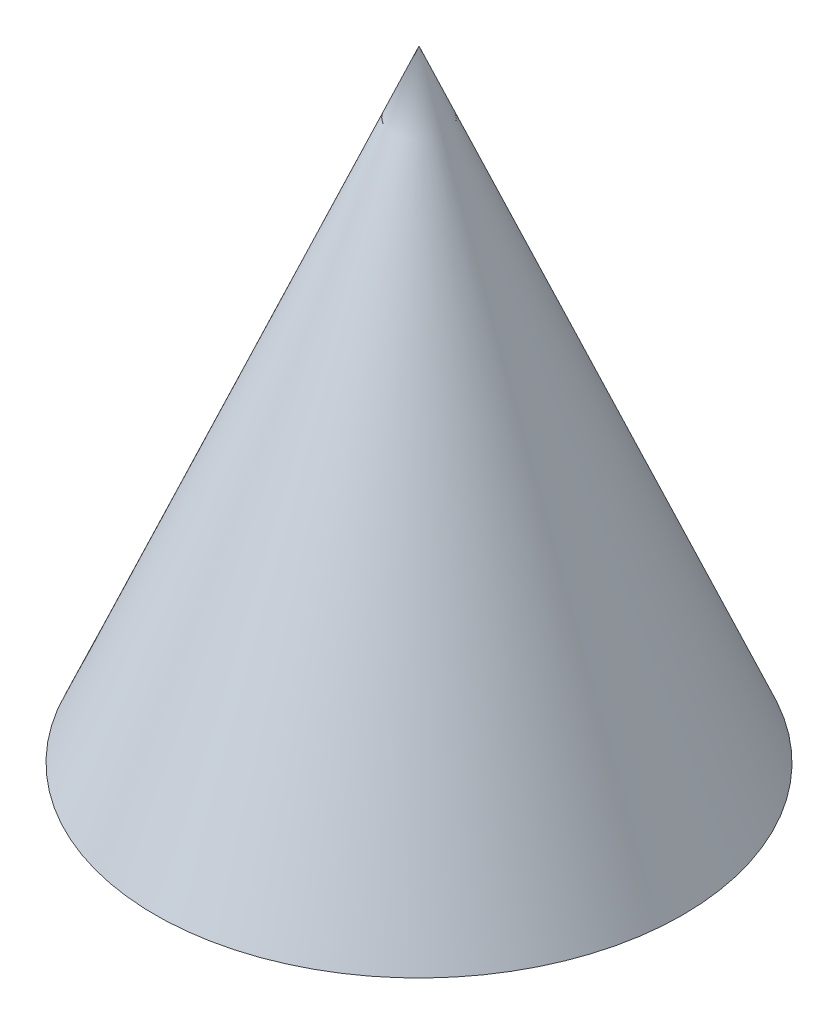
ISO-10303-21;
HEADER;
FILE_DESCRIPTION(('STEP AP214'),'2;1');
FILE_NAME('part.step','',(''),(''),'','','');
FILE_SCHEMA(('AUTOMOTIVE_DESIGN { 1 0 10303 214 1 1 1 1 }'));
ENDSEC;
DATA;
#1=APPLICATION_CONTEXT('core data for automotive mechanical design processes');
#2=APPLICATION_PROTOCOL_DEFINITION('international standard','automotive_design',2000,#1);
#3=PRODUCT_CONTEXT('',#1,'mechanical');
#4=PRODUCT('Part','Part','',(#3));
#5=PRODUCT_RELATED_PRODUCT_CATEGORY('part','',(#4));
#6=PRODUCT_DEFINITION_FORMATION('','',#4);
#7=PRODUCT_DEFINITION_CONTEXT('part definition',#1,'design');
#8=PRODUCT_DEFINITION('design','',#6,#7);
#9=PRODUCT_DEFINITION_SHAPE('','',#8);
#10=(LENGTH_UNIT() NAMED_UNIT(*) SI_UNIT(.MILLI.,.METRE.));
#11=(NAMED_UNIT(*) PLANE_ANGLE_UNIT() SI_UNIT($,.RADIAN.));
#12=(NAMED_UNIT(*) SI_UNIT($,.STERADIAN.) SOLID_ANGLE_UNIT());
#13=UNCERTAINTY_MEASURE_WITH_UNIT(LENGTH_MEASURE(1.E-05),#10,'distance_accuracy_value','');
#14=(GEOMETRIC_REPRESENTATION_CONTEXT(3) GLOBAL_UNCERTAINTY_ASSIGNED_CONTEXT((#13)) GLOBAL_UNIT_ASSIGNED_CONTEXT((#10,
#11,#12)) REPRESENTATION_CONTEXT('',''));
#15=CARTESIAN_POINT('',(0.,0.,0.));
#16=DIRECTION('',(0.,0.,1.));
#17=DIRECTION('',(1.,0.,0.));
#18=AXIS2_PLACEMENT_3D('',#15,#16,#17);
#19=CARTESIAN_POINT('',(0.,0.,0.));
#20=DIRECTION('',(0.,1.,0.));
#21=DIRECTION('',(-1.,0.,0.));
#22=AXIS2_PLACEMENT_3D('',#19,#20,#21);
#23=PLANE('',#22);
#24=CARTESIAN_POINT('',(0.,0.,0.));
#25=DIRECTION('',(0.,1.,0.));
#26=DIRECTION('',(-1.,0.,0.));
#27=AXIS2_PLACEMENT_3D('',#24,#25,#26);
#28=CIRCLE('',#27,1700.);
#29=CARTESIAN_POINT('',(-1700.,0.,0.));
#30=VERTEX_POINT('',#29);
#31=EDGE_CURVE('E11',#30,#30,#28,.T.);
#32=ORIENTED_EDGE('',*,*,#31,.F.);
#33=EDGE_LOOP('',(#32));
#34=FACE_BOUND('',#33,.T.);
#35=ADVANCED_FACE('F43',(#34),#23,.F.);
#36=CARTESIAN_POINT('',(0.,0.,0.));
#37=DIRECTION('',(0.,-1.,0.));
#38=DIRECTION('',(1.,0.,0.));
#39=AXIS2_PLACEMENT_3D('',#36,#37,#38);
#40=CONICAL_SURFACE('',#39,1700.,0.401870647440457);
#41=CARTESIAN_POINT('',(-1.97140511050713E-13,4000.,0.));
#42=VERTEX_POINT('',#41);
#43=VERTEX_LOOP('',#42);
#44=FACE_BOUND('',#43,.T.);
#45=ORIENTED_EDGE('',*,*,#31,.T.);
#46=EDGE_LOOP('',(#45));
#47=FACE_BOUND('',#46,.T.);
#48=ADVANCED_FACE('F51',(#44,#47),#40,.T.);
#49=CLOSED_SHELL('',(#35,#48));
#50=MANIFOLD_SOLID_BREP('B2',#49);
#51=ADVANCED_BREP_SHAPE_REPRESENTATION('',(#18,#50),#14);
#52=SHAPE_DEFINITION_REPRESENTATION(#9,#51);
ENDSEC;
END-ISO-10303-21;
